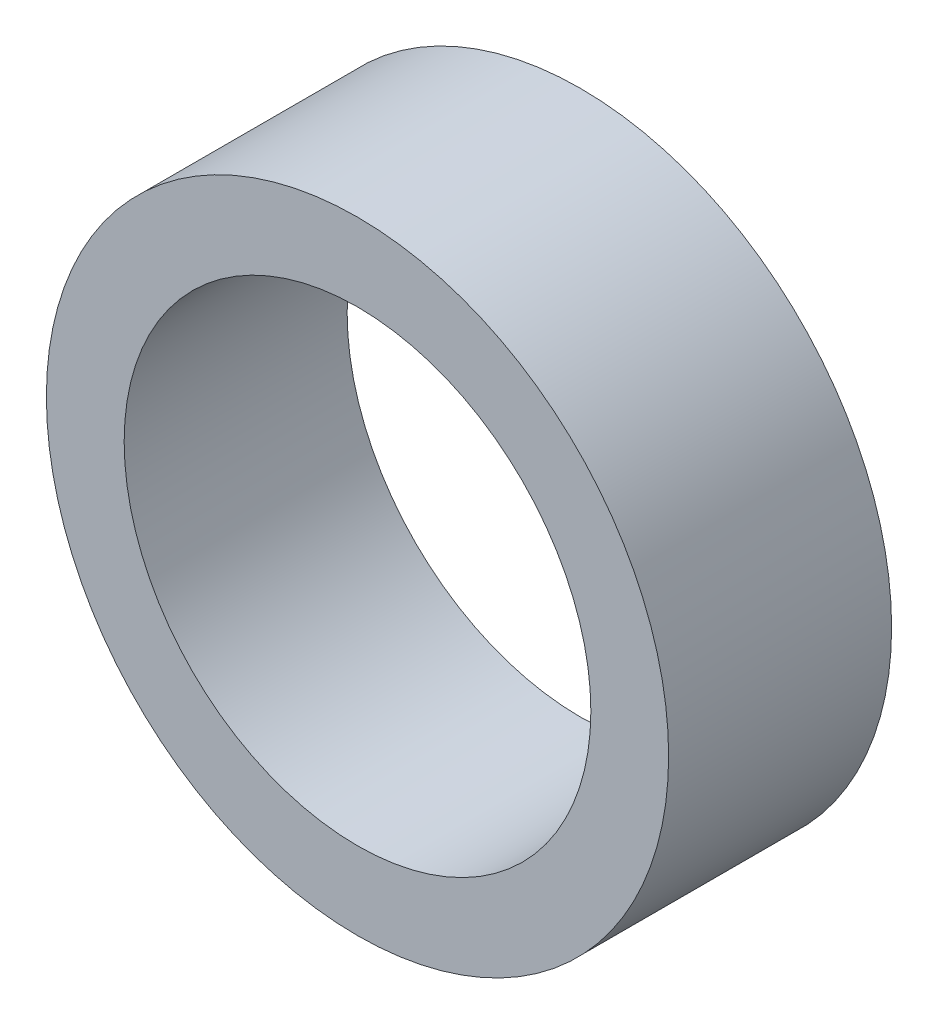
ISO-10303-21;
HEADER;
FILE_DESCRIPTION(('STEP AP214'),'2;1');
FILE_NAME('part.step','',(''),(''),'','','');
FILE_SCHEMA(('AUTOMOTIVE_DESIGN { 1 0 10303 214 1 1 1 1 }'));
ENDSEC;
DATA;
#1=APPLICATION_CONTEXT('core data for automotive mechanical design processes');
#2=APPLICATION_PROTOCOL_DEFINITION('international standard','automotive_design',2000,#1);
#3=PRODUCT_CONTEXT('',#1,'mechanical');
#4=PRODUCT('Part','Part','',(#3));
#5=PRODUCT_RELATED_PRODUCT_CATEGORY('part','',(#4));
#6=PRODUCT_DEFINITION_FORMATION('','',#4);
#7=PRODUCT_DEFINITION_CONTEXT('part definition',#1,'design');
#8=PRODUCT_DEFINITION('design','',#6,#7);
#9=PRODUCT_DEFINITION_SHAPE('','',#8);
#10=(LENGTH_UNIT() NAMED_UNIT(*) SI_UNIT(.MILLI.,.METRE.));
#11=(NAMED_UNIT(*) PLANE_ANGLE_UNIT() SI_UNIT($,.RADIAN.));
#12=(NAMED_UNIT(*) SI_UNIT($,.STERADIAN.) SOLID_ANGLE_UNIT());
#13=UNCERTAINTY_MEASURE_WITH_UNIT(LENGTH_MEASURE(1.E-05),#10,'distance_accuracy_value','');
#14=(GEOMETRIC_REPRESENTATION_CONTEXT(3) GLOBAL_UNCERTAINTY_ASSIGNED_CONTEXT((#13)) GLOBAL_UNIT_ASSIGNED_CONTEXT((#10,
#11,#12)) REPRESENTATION_CONTEXT('',''));
#15=CARTESIAN_POINT('',(0.,0.,0.));
#16=DIRECTION('',(0.,0.,1.));
#17=DIRECTION('',(1.,0.,0.));
#18=AXIS2_PLACEMENT_3D('',#15,#16,#17);
#19=CARTESIAN_POINT('',(0.,0.,2.15));
#20=DIRECTION('',(0.,0.,1.));
#21=DIRECTION('',(1.,0.,0.));
#22=AXIS2_PLACEMENT_3D('',#19,#20,#21);
#23=PLANE('',#22);
#24=CARTESIAN_POINT('',(0.,0.,2.15));
#25=DIRECTION('',(0.,0.,1.));
#26=DIRECTION('',(1.,0.,0.));
#27=AXIS2_PLACEMENT_3D('',#24,#25,#26);
#28=CIRCLE('',#27,3.);
#29=CARTESIAN_POINT('',(-3.,0.,2.15));
#30=VERTEX_POINT('',#29);
#31=EDGE_CURVE('E10',#30,#30,#28,.T.);
#32=ORIENTED_EDGE('',*,*,#31,.T.);
#33=EDGE_LOOP('',(#32));
#34=FACE_BOUND('',#33,.T.);
#35=CARTESIAN_POINT('',(0.,0.,2.15));
#36=DIRECTION('',(0.,0.,1.));
#37=DIRECTION('',(1.,0.,0.));
#38=AXIS2_PLACEMENT_3D('',#35,#36,#37);
#39=CIRCLE('',#38,2.25);
#40=CARTESIAN_POINT('',(-2.25,0.,2.15));
#41=VERTEX_POINT('',#40);
#42=EDGE_CURVE('E56',#41,#41,#39,.T.);
#43=ORIENTED_EDGE('',*,*,#42,.F.);
#44=EDGE_LOOP('',(#43));
#45=FACE_BOUND('',#44,.T.);
#46=ADVANCED_FACE('F43',(#34,#45),#23,.T.);
#47=CARTESIAN_POINT('',(0.,0.,0.));
#48=DIRECTION('',(0.,0.,1.));
#49=DIRECTION('',(1.,0.,0.));
#50=AXIS2_PLACEMENT_3D('',#47,#48,#49);
#51=PLANE('',#50);
#52=CARTESIAN_POINT('',(0.,0.,0.));
#53=DIRECTION('',(0.,0.,1.));
#54=DIRECTION('',(1.,0.,0.));
#55=AXIS2_PLACEMENT_3D('',#52,#53,#54);
#56=CIRCLE('',#55,3.);
#57=CARTESIAN_POINT('',(-3.,0.,0.));
#58=VERTEX_POINT('',#57);
#59=EDGE_CURVE('E47',#58,#58,#56,.T.);
#60=ORIENTED_EDGE('',*,*,#59,.F.);
#61=EDGE_LOOP('',(#60));
#62=FACE_BOUND('',#61,.T.);
#63=CARTESIAN_POINT('',(0.,0.,0.));
#64=DIRECTION('',(0.,0.,1.));
#65=DIRECTION('',(1.,0.,0.));
#66=AXIS2_PLACEMENT_3D('',#63,#64,#65);
#67=CIRCLE('',#66,2.25);
#68=CARTESIAN_POINT('',(-2.25,0.,0.));
#69=VERTEX_POINT('',#68);
#70=EDGE_CURVE('E58',#69,#69,#67,.T.);
#71=ORIENTED_EDGE('',*,*,#70,.T.);
#72=EDGE_LOOP('',(#71));
#73=FACE_BOUND('',#72,.T.);
#74=ADVANCED_FACE('F70',(#62,#73),#51,.F.);
#75=CARTESIAN_POINT('',(0.,0.,2.15));
#76=DIRECTION('',(0.,0.,-1.));
#77=DIRECTION('',(-1.,0.,0.));
#78=AXIS2_PLACEMENT_3D('',#75,#76,#77);
#79=CYLINDRICAL_SURFACE('',#78,3.);
#80=CARTESIAN_POINT('',(-3.,0.,2.15));
#81=CARTESIAN_POINT('',(-3.,0.,2.12760416666667));
#82=CARTESIAN_POINT('',(-3.,0.,2.10520833333333));
#83=CARTESIAN_POINT('',(-3.,0.,2.06041666666667));
#84=CARTESIAN_POINT('',(-3.,0.,2.03802083333333));
#85=CARTESIAN_POINT('',(-3.,0.,1.99322916666667));
#86=CARTESIAN_POINT('',(-3.,0.,1.97083333333333));
#87=CARTESIAN_POINT('',(-3.,0.,1.92604166666667));
#88=CARTESIAN_POINT('',(-3.,0.,1.90364583333333));
#89=CARTESIAN_POINT('',(-3.,0.,1.85885416666667));
#90=CARTESIAN_POINT('',(-3.,0.,1.83645833333333));
#91=CARTESIAN_POINT('',(-3.,0.,1.79166666666667));
#92=CARTESIAN_POINT('',(-3.,0.,1.76927083333333));
#93=CARTESIAN_POINT('',(-3.,0.,1.72447916666667));
#94=CARTESIAN_POINT('',(-3.,0.,1.70208333333333));
#95=CARTESIAN_POINT('',(-3.,0.,1.65729166666667));
#96=CARTESIAN_POINT('',(-3.,0.,1.63489583333333));
#97=CARTESIAN_POINT('',(-3.,0.,1.59010416666667));
#98=CARTESIAN_POINT('',(-3.,0.,1.56770833333333));
#99=CARTESIAN_POINT('',(-3.,0.,1.52291666666667));
#100=CARTESIAN_POINT('',(-3.,0.,1.50052083333333));
#101=CARTESIAN_POINT('',(-3.,0.,1.45572916666667));
#102=CARTESIAN_POINT('',(-3.,0.,1.43333333333333));
#103=CARTESIAN_POINT('',(-3.,0.,1.38854166666667));
#104=CARTESIAN_POINT('',(-3.,0.,1.36614583333333));
#105=CARTESIAN_POINT('',(-3.,0.,1.32135416666667));
#106=CARTESIAN_POINT('',(-3.,0.,1.29895833333333));
#107=CARTESIAN_POINT('',(-3.,0.,1.25416666666667));
#108=CARTESIAN_POINT('',(-3.,0.,1.23177083333333));
#109=CARTESIAN_POINT('',(-3.,0.,1.18697916666667));
#110=CARTESIAN_POINT('',(-3.,0.,1.16458333333333));
#111=CARTESIAN_POINT('',(-3.,0.,1.11979166666667));
#112=CARTESIAN_POINT('',(-3.,0.,1.09739583333333));
#113=CARTESIAN_POINT('',(-3.,0.,1.05260416666667));
#114=CARTESIAN_POINT('',(-3.,0.,1.03020833333333));
#115=CARTESIAN_POINT('',(-3.,0.,0.985416666666666));
#116=CARTESIAN_POINT('',(-3.,0.,0.963020833333333));
#117=CARTESIAN_POINT('',(-3.,0.,0.918229166666666));
#118=CARTESIAN_POINT('',(-3.,0.,0.895833333333333));
#119=CARTESIAN_POINT('',(-3.,0.,0.851041666666666));
#120=CARTESIAN_POINT('',(-3.,0.,0.828645833333333));
#121=CARTESIAN_POINT('',(-3.,0.,0.783854166666666));
#122=CARTESIAN_POINT('',(-3.,0.,0.761458333333333));
#123=CARTESIAN_POINT('',(-3.,0.,0.716666666666666));
#124=CARTESIAN_POINT('',(-3.,0.,0.694270833333333));
#125=CARTESIAN_POINT('',(-3.,0.,0.649479166666666));
#126=CARTESIAN_POINT('',(-3.,0.,0.627083333333333));
#127=CARTESIAN_POINT('',(-3.,0.,0.582291666666666));
#128=CARTESIAN_POINT('',(-3.,0.,0.559895833333333));
#129=CARTESIAN_POINT('',(-3.,0.,0.515104166666666));
#130=CARTESIAN_POINT('',(-3.,0.,0.492708333333333));
#131=CARTESIAN_POINT('',(-3.,0.,0.447916666666666));
#132=CARTESIAN_POINT('',(-3.,0.,0.425520833333333));
#133=CARTESIAN_POINT('',(-3.,0.,0.380729166666666));
#134=CARTESIAN_POINT('',(-3.,0.,0.358333333333333));
#135=CARTESIAN_POINT('',(-3.,0.,0.313541666666666));
#136=CARTESIAN_POINT('',(-3.,0.,0.291145833333333));
#137=CARTESIAN_POINT('',(-3.,0.,0.246354166666666));
#138=CARTESIAN_POINT('',(-3.,0.,0.223958333333333));
#139=CARTESIAN_POINT('',(-3.,0.,0.179166666666666));
#140=CARTESIAN_POINT('',(-3.,0.,0.156770833333333));
#141=CARTESIAN_POINT('',(-3.,0.,0.111979166666666));
#142=CARTESIAN_POINT('',(-3.,0.,0.0895833333333329));
#143=CARTESIAN_POINT('',(-3.,0.,0.0447916666666662));
#144=CARTESIAN_POINT('',(-3.,0.,0.0223958333333329));
#145=CARTESIAN_POINT('',(-3.,0.,0.));
#146=B_SPLINE_CURVE_WITH_KNOTS('',3,(#80,#81,#82,#83,#84,#85,#86,#87,#88,#89,#90,#91,#92,#93,
#94,#95,#96,#97,#98,#99,#100,#101,#102,#103,#104,#105,#106,#107,#108,#109,#110,#111,#112,#113,
#114,#115,#116,#117,#118,#119,#120,#121,#122,#123,#124,#125,#126,#127,#128,#129,#130,#131,#132,
#133,#134,#135,#136,#137,#138,#139,#140,#141,#142,#143,#144,#145),.UNSPECIFIED.,.F.,.F.,(4,2,2,
2,2,2,2,2,2,2,2,2,2,2,2,2,2,2,2,2,2,2,2,2,2,2,2,2,2,2,2,2,4),(0.,0.0671875000000004,0.134375,
0.2015625,0.26875,0.3359375,0.403125,0.4703125,0.5375,0.6046875,0.671875,0.739062500000001,
0.806250000000001,0.873437500000001,0.940625,1.0078125,1.075,1.1421875,1.209375,1.2765625,
1.34375,1.4109375,1.478125,1.5453125,1.6125,1.6796875,1.746875,1.8140625,1.88125,1.9484375,
2.015625,2.0828125,2.15),.UNSPECIFIED.);
#147=EDGE_CURVE('BSEAM45',#30,#58,#146,.T.);
#148=ORIENTED_EDGE('',*,*,#31,.F.);
#149=ORIENTED_EDGE('',*,*,#59,.T.);
#150=ORIENTED_EDGE('',*,*,#147,.T.);
#151=ORIENTED_EDGE('',*,*,#147,.F.);
#152=EDGE_LOOP('',(#148,#150,#149,#151));
#153=FACE_BOUND('',#152,.T.);
#154=ADVANCED_FACE('F45',(#153),#79,.T.);
#155=CARTESIAN_POINT('',(0.,0.,2.15));
#156=DIRECTION('',(0.,0.,-1.));
#157=DIRECTION('',(-1.,0.,0.));
#158=AXIS2_PLACEMENT_3D('',#155,#156,#157);
#159=CYLINDRICAL_SURFACE('',#158,2.25);
#160=CARTESIAN_POINT('',(-2.25,0.,2.15));
#161=CARTESIAN_POINT('',(-2.25,0.,2.12760416666667));
#162=CARTESIAN_POINT('',(-2.25,0.,2.10520833333333));
#163=CARTESIAN_POINT('',(-2.25,0.,2.06041666666667));
#164=CARTESIAN_POINT('',(-2.25,0.,2.03802083333333));
#165=CARTESIAN_POINT('',(-2.25,0.,1.99322916666667));
#166=CARTESIAN_POINT('',(-2.25,0.,1.97083333333333));
#167=CARTESIAN_POINT('',(-2.25,0.,1.92604166666667));
#168=CARTESIAN_POINT('',(-2.25,0.,1.90364583333333));
#169=CARTESIAN_POINT('',(-2.25,0.,1.85885416666667));
#170=CARTESIAN_POINT('',(-2.25,0.,1.83645833333333));
#171=CARTESIAN_POINT('',(-2.25,0.,1.79166666666667));
#172=CARTESIAN_POINT('',(-2.25,0.,1.76927083333333));
#173=CARTESIAN_POINT('',(-2.25,0.,1.72447916666667));
#174=CARTESIAN_POINT('',(-2.25,0.,1.70208333333333));
#175=CARTESIAN_POINT('',(-2.25,0.,1.65729166666667));
#176=CARTESIAN_POINT('',(-2.25,0.,1.63489583333333));
#177=CARTESIAN_POINT('',(-2.25,0.,1.59010416666667));
#178=CARTESIAN_POINT('',(-2.25,0.,1.56770833333333));
#179=CARTESIAN_POINT('',(-2.25,0.,1.52291666666667));
#180=CARTESIAN_POINT('',(-2.25,0.,1.50052083333333));
#181=CARTESIAN_POINT('',(-2.25,0.,1.45572916666667));
#182=CARTESIAN_POINT('',(-2.25,0.,1.43333333333333));
#183=CARTESIAN_POINT('',(-2.25,0.,1.38854166666667));
#184=CARTESIAN_POINT('',(-2.25,0.,1.36614583333333));
#185=CARTESIAN_POINT('',(-2.25,0.,1.32135416666667));
#186=CARTESIAN_POINT('',(-2.25,0.,1.29895833333333));
#187=CARTESIAN_POINT('',(-2.25,0.,1.25416666666667));
#188=CARTESIAN_POINT('',(-2.25,0.,1.23177083333333));
#189=CARTESIAN_POINT('',(-2.25,0.,1.18697916666667));
#190=CARTESIAN_POINT('',(-2.25,0.,1.16458333333333));
#191=CARTESIAN_POINT('',(-2.25,0.,1.11979166666667));
#192=CARTESIAN_POINT('',(-2.25,0.,1.09739583333333));
#193=CARTESIAN_POINT('',(-2.25,0.,1.05260416666667));
#194=CARTESIAN_POINT('',(-2.25,0.,1.03020833333333));
#195=CARTESIAN_POINT('',(-2.25,0.,0.985416666666667));
#196=CARTESIAN_POINT('',(-2.25,0.,0.963020833333333));
#197=CARTESIAN_POINT('',(-2.25,0.,0.918229166666666));
#198=CARTESIAN_POINT('',(-2.25,0.,0.895833333333333));
#199=CARTESIAN_POINT('',(-2.25,0.,0.851041666666666));
#200=CARTESIAN_POINT('',(-2.25,0.,0.828645833333333));
#201=CARTESIAN_POINT('',(-2.25,0.,0.783854166666666));
#202=CARTESIAN_POINT('',(-2.25,0.,0.761458333333333));
#203=CARTESIAN_POINT('',(-2.25,0.,0.716666666666666));
#204=CARTESIAN_POINT('',(-2.25,0.,0.694270833333333));
#205=CARTESIAN_POINT('',(-2.25,0.,0.649479166666666));
#206=CARTESIAN_POINT('',(-2.25,0.,0.627083333333333));
#207=CARTESIAN_POINT('',(-2.25,0.,0.582291666666666));
#208=CARTESIAN_POINT('',(-2.25,0.,0.559895833333333));
#209=CARTESIAN_POINT('',(-2.25,0.,0.515104166666666));
#210=CARTESIAN_POINT('',(-2.25,0.,0.492708333333333));
#211=CARTESIAN_POINT('',(-2.25,0.,0.447916666666666));
#212=CARTESIAN_POINT('',(-2.25,0.,0.425520833333333));
#213=CARTESIAN_POINT('',(-2.25,0.,0.380729166666666));
#214=CARTESIAN_POINT('',(-2.25,0.,0.358333333333333));
#215=CARTESIAN_POINT('',(-2.25,0.,0.313541666666666));
#216=CARTESIAN_POINT('',(-2.25,0.,0.291145833333333));
#217=CARTESIAN_POINT('',(-2.25,0.,0.246354166666666));
#218=CARTESIAN_POINT('',(-2.25,0.,0.223958333333333));
#219=CARTESIAN_POINT('',(-2.25,0.,0.179166666666666));
#220=CARTESIAN_POINT('',(-2.25,0.,0.156770833333333));
#221=CARTESIAN_POINT('',(-2.25,0.,0.111979166666666));
#222=CARTESIAN_POINT('',(-2.25,0.,0.0895833333333329));
#223=CARTESIAN_POINT('',(-2.25,0.,0.0447916666666662));
#224=CARTESIAN_POINT('',(-2.25,0.,0.0223958333333329));
#225=CARTESIAN_POINT('',(-2.25,0.,0.));
#226=B_SPLINE_CURVE_WITH_KNOTS('',3,(#160,#161,#162,#163,#164,#165,#166,#167,#168,#169,#170,
#171,#172,#173,#174,#175,#176,#177,#178,#179,#180,#181,#182,#183,#184,#185,#186,#187,#188,#189,
#190,#191,#192,#193,#194,#195,#196,#197,#198,#199,#200,#201,#202,#203,#204,#205,#206,#207,#208,
#209,#210,#211,#212,#213,#214,#215,#216,#217,#218,#219,#220,#221,#222,#223,#224,#225),
.UNSPECIFIED.,.F.,.F.,(4,2,2,2,2,2,2,2,2,2,2,2,2,2,2,2,2,2,2,2,2,2,2,2,2,2,2,2,2,2,2,2,4),(0.,
0.0671875,0.134375,0.2015625,0.26875,0.3359375,0.403125,0.4703125,0.5375,0.6046875,0.671875,
0.7390625,0.80625,0.8734375,0.940625,1.0078125,1.075,1.1421875,1.209375,1.2765625,1.34375,
1.4109375,1.478125,1.5453125,1.6125,1.6796875,1.746875,1.8140625,1.88125,1.9484375,2.015625,
2.0828125,2.15),.UNSPECIFIED.);
#227=EDGE_CURVE('BSEAM66',#41,#69,#226,.T.);
#228=ORIENTED_EDGE('',*,*,#42,.T.);
#229=ORIENTED_EDGE('',*,*,#70,.F.);
#230=ORIENTED_EDGE('',*,*,#227,.T.);
#231=ORIENTED_EDGE('',*,*,#227,.F.);
#232=EDGE_LOOP('',(#228,#230,#229,#231));
#233=FACE_BOUND('',#232,.T.);
#234=ADVANCED_FACE('F66',(#233),#159,.F.);
#235=CLOSED_SHELL('',(#46,#74,#154,#234));
#236=MANIFOLD_SOLID_BREP('B2',#235);
#237=ADVANCED_BREP_SHAPE_REPRESENTATION('',(#18,#236),#14);
#238=SHAPE_DEFINITION_REPRESENTATION(#9,#237);
ENDSEC;
END-ISO-10303-21;
